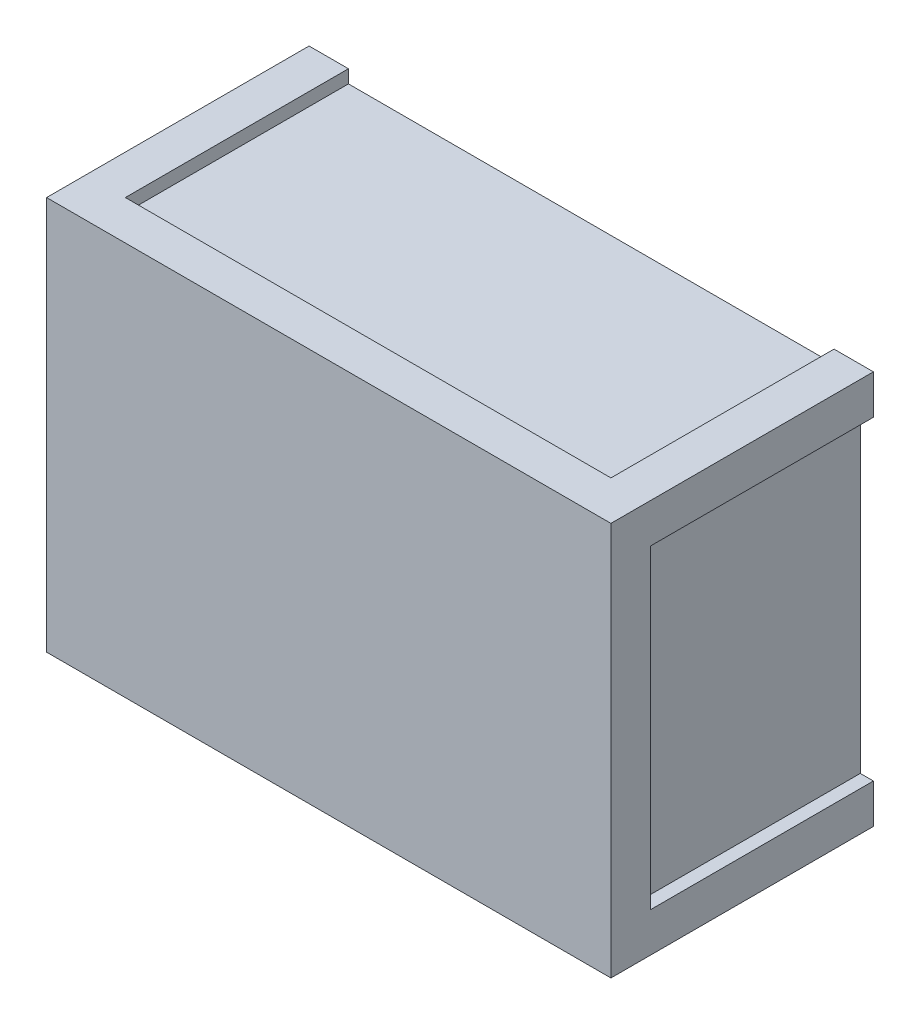
ISO-10303-21;
HEADER;
FILE_DESCRIPTION(('STEP AP214'),'2;1');
FILE_NAME('part.step','',(''),(''),'','','');
FILE_SCHEMA(('AUTOMOTIVE_DESIGN { 1 0 10303 214 1 1 1 1 }'));
ENDSEC;
DATA;
#1=APPLICATION_CONTEXT('core data for automotive mechanical design processes');
#2=APPLICATION_PROTOCOL_DEFINITION('international standard','automotive_design',2000,#1);
#3=PRODUCT_CONTEXT('',#1,'mechanical');
#4=PRODUCT('Part','Part','',(#3));
#5=PRODUCT_RELATED_PRODUCT_CATEGORY('part','',(#4));
#6=PRODUCT_DEFINITION_FORMATION('','',#4);
#7=PRODUCT_DEFINITION_CONTEXT('part definition',#1,'design');
#8=PRODUCT_DEFINITION('design','',#6,#7);
#9=PRODUCT_DEFINITION_SHAPE('','',#8);
#10=(LENGTH_UNIT() NAMED_UNIT(*) SI_UNIT(.MILLI.,.METRE.));
#11=(NAMED_UNIT(*) PLANE_ANGLE_UNIT() SI_UNIT($,.RADIAN.));
#12=(NAMED_UNIT(*) SI_UNIT($,.STERADIAN.) SOLID_ANGLE_UNIT());
#13=UNCERTAINTY_MEASURE_WITH_UNIT(LENGTH_MEASURE(1.E-05),#10,'distance_accuracy_value','');
#14=(GEOMETRIC_REPRESENTATION_CONTEXT(3) GLOBAL_UNCERTAINTY_ASSIGNED_CONTEXT((#13)) GLOBAL_UNIT_ASSIGNED_CONTEXT((#10,
#11,#12)) REPRESENTATION_CONTEXT('',''));
#15=CARTESIAN_POINT('',(0.,0.,0.));
#16=DIRECTION('',(0.,0.,1.));
#17=DIRECTION('',(1.,0.,0.));
#18=AXIS2_PLACEMENT_3D('',#15,#16,#17);
#19=CARTESIAN_POINT('',(0.,0.,0.));
#20=DIRECTION('',(0.,0.,-1.));
#21=DIRECTION('',(-1.,0.,0.));
#22=AXIS2_PLACEMENT_3D('',#19,#20,#21);
#23=PLANE('',#22);
#24=DIRECTION('',(0.,-1.,0.));
#25=VECTOR('',#24,1.);
#26=CARTESIAN_POINT('',(200.,400.,0.));
#27=LINE('',#26,#25);
#28=CARTESIAN_POINT('',(200.,2800.,0.));
#29=VERTEX_POINT('',#28);
#30=CARTESIAN_POINT('',(200.,400.,0.));
#31=VERTEX_POINT('',#30);
#32=EDGE_CURVE('E182',#29,#31,#27,.T.);
#33=ORIENTED_EDGE('',*,*,#32,.F.);
#34=DIRECTION('',(1.,0.,0.));
#35=VECTOR('',#34,1.);
#36=CARTESIAN_POINT('',(0.,2800.,0.));
#37=LINE('',#36,#35);
#38=CARTESIAN_POINT('',(99.9999999999996,2800.,0.));
#39=VERTEX_POINT('',#38);
#40=EDGE_CURVE('E189',#39,#29,#37,.T.);
#41=ORIENTED_EDGE('',*,*,#40,.F.);
#42=DIRECTION('',(0.,-1.,0.));
#43=VECTOR('',#42,1.);
#44=CARTESIAN_POINT('',(100.,100.,0.));
#45=LINE('',#44,#43);
#46=CARTESIAN_POINT('',(100.,3100.,0.));
#47=VERTEX_POINT('',#46);
#48=EDGE_CURVE('E315',#47,#39,#45,.T.);
#49=ORIENTED_EDGE('',*,*,#48,.F.);
#50=DIRECTION('',(-1.,0.,0.));
#51=VECTOR('',#50,1.);
#52=CARTESIAN_POINT('',(4400.,3100.,0.));
#53=LINE('',#52,#51);
#54=CARTESIAN_POINT('',(400.,3100.,0.));
#55=VERTEX_POINT('',#54);
#56=EDGE_CURVE('E294',#55,#47,#53,.T.);
#57=ORIENTED_EDGE('',*,*,#56,.F.);
#58=DIRECTION('',(0.,1.,0.));
#59=VECTOR('',#58,1.);
#60=CARTESIAN_POINT('',(400.,3200.,0.));
#61=LINE('',#60,#59);
#62=CARTESIAN_POINT('',(400.,3000.,0.));
#63=VERTEX_POINT('',#62);
#64=EDGE_CURVE('E251',#63,#55,#61,.T.);
#65=ORIENTED_EDGE('',*,*,#64,.F.);
#66=DIRECTION('',(-1.,0.,0.));
#67=VECTOR('',#66,1.);
#68=CARTESIAN_POINT('',(400.,3000.,0.));
#69=LINE('',#68,#67);
#70=CARTESIAN_POINT('',(4100.,3000.,0.));
#71=VERTEX_POINT('',#70);
#72=EDGE_CURVE('E244',#71,#63,#69,.T.);
#73=ORIENTED_EDGE('',*,*,#72,.F.);
#74=DIRECTION('',(0.,-1.,0.));
#75=VECTOR('',#74,1.);
#76=CARTESIAN_POINT('',(4100.,3200.,0.));
#77=LINE('',#76,#75);
#78=CARTESIAN_POINT('',(4100.,3100.,0.));
#79=VERTEX_POINT('',#78);
#80=EDGE_CURVE('E230',#79,#71,#77,.T.);
#81=ORIENTED_EDGE('',*,*,#80,.F.);
#82=CARTESIAN_POINT('',(4400.,3100.,0.));
#83=VERTEX_POINT('',#82);
#84=EDGE_CURVE('E303',#83,#79,#53,.T.);
#85=ORIENTED_EDGE('',*,*,#84,.F.);
#86=DIRECTION('',(0.,1.,0.));
#87=VECTOR('',#86,1.);
#88=CARTESIAN_POINT('',(4400.,100.,0.));
#89=LINE('',#88,#87);
#90=CARTESIAN_POINT('',(4400.,2800.,0.));
#91=VERTEX_POINT('',#90);
#92=EDGE_CURVE('E309',#91,#83,#89,.T.);
#93=ORIENTED_EDGE('',*,*,#92,.F.);
#94=DIRECTION('',(1.,0.,0.));
#95=VECTOR('',#94,1.);
#96=CARTESIAN_POINT('',(4500.,2800.,0.));
#97=LINE('',#96,#95);
#98=CARTESIAN_POINT('',(4300.,2800.,0.));
#99=VERTEX_POINT('',#98);
#100=EDGE_CURVE('E222',#99,#91,#97,.T.);
#101=ORIENTED_EDGE('',*,*,#100,.F.);
#102=DIRECTION('',(0.,1.,0.));
#103=VECTOR('',#102,1.);
#104=CARTESIAN_POINT('',(4300.,400.,0.));
#105=LINE('',#104,#103);
#106=CARTESIAN_POINT('',(4300.,400.,0.));
#107=VERTEX_POINT('',#106);
#108=EDGE_CURVE('E231',#107,#99,#105,.T.);
#109=ORIENTED_EDGE('',*,*,#108,.F.);
#110=DIRECTION('',(-1.,0.,0.));
#111=VECTOR('',#110,1.);
#112=CARTESIAN_POINT('',(4500.,400.,0.));
#113=LINE('',#112,#111);
#114=CARTESIAN_POINT('',(4400.,400.,0.));
#115=VERTEX_POINT('',#114);
#116=EDGE_CURVE('E235',#115,#107,#113,.T.);
#117=ORIENTED_EDGE('',*,*,#116,.F.);
#118=CARTESIAN_POINT('',(4400.,100.,0.));
#119=VERTEX_POINT('',#118);
#120=EDGE_CURVE('E42',#119,#115,#89,.T.);
#121=ORIENTED_EDGE('',*,*,#120,.F.);
#122=DIRECTION('',(1.,0.,0.));
#123=VECTOR('',#122,1.);
#124=CARTESIAN_POINT('',(4400.,100.,0.));
#125=LINE('',#124,#123);
#126=CARTESIAN_POINT('',(4100.,100.,0.));
#127=VERTEX_POINT('',#126);
#128=EDGE_CURVE('E314',#127,#119,#125,.T.);
#129=ORIENTED_EDGE('',*,*,#128,.F.);
#130=DIRECTION('',(0.,-1.,0.));
#131=VECTOR('',#130,1.);
#132=CARTESIAN_POINT('',(4100.,0.,0.));
#133=LINE('',#132,#131);
#134=CARTESIAN_POINT('',(4100.,200.,0.));
#135=VERTEX_POINT('',#134);
#136=EDGE_CURVE('E212',#135,#127,#133,.T.);
#137=ORIENTED_EDGE('',*,*,#136,.F.);
#138=DIRECTION('',(1.,0.,0.));
#139=VECTOR('',#138,1.);
#140=CARTESIAN_POINT('',(4100.,200.,0.));
#141=LINE('',#140,#139);
#142=CARTESIAN_POINT('',(400.,200.,0.));
#143=VERTEX_POINT('',#142);
#144=EDGE_CURVE('E203',#143,#135,#141,.T.);
#145=ORIENTED_EDGE('',*,*,#144,.F.);
#146=DIRECTION('',(0.,1.,0.));
#147=VECTOR('',#146,1.);
#148=CARTESIAN_POINT('',(400.,0.,0.));
#149=LINE('',#148,#147);
#150=CARTESIAN_POINT('',(400.,100.,0.));
#151=VERTEX_POINT('',#150);
#152=EDGE_CURVE('E210',#151,#143,#149,.T.);
#153=ORIENTED_EDGE('',*,*,#152,.F.);
#154=CARTESIAN_POINT('',(100.,100.,0.));
#155=VERTEX_POINT('',#154);
#156=EDGE_CURVE('E310',#155,#151,#125,.T.);
#157=ORIENTED_EDGE('',*,*,#156,.F.);
#158=CARTESIAN_POINT('',(99.9999999999996,400.,0.));
#159=VERTEX_POINT('',#158);
#160=EDGE_CURVE('E193',#159,#155,#45,.T.);
#161=ORIENTED_EDGE('',*,*,#160,.F.);
#162=DIRECTION('',(-1.,0.,0.));
#163=VECTOR('',#162,1.);
#164=CARTESIAN_POINT('',(0.,400.,0.));
#165=LINE('',#164,#163);
#166=EDGE_CURVE('E174',#31,#159,#165,.T.);
#167=ORIENTED_EDGE('',*,*,#166,.F.);
#168=EDGE_LOOP('',(#33,#41,#49,#57,#65,#73,#81,#85,#93,#101,#109,#117,#121,#129,#137,#145,#153,
#157,#161,#167));
#169=FACE_BOUND('',#168,.T.);
#170=ADVANCED_FACE('F35',(#169),#23,.T.);
#171=CARTESIAN_POINT('',(4400.,3100.,-5243.09069156733));
#172=DIRECTION('',(0.,1.,0.));
#173=DIRECTION('',(0.,0.,1.));
#174=AXIS2_PLACEMENT_3D('',#171,#172,#173);
#175=PLANE('',#174);
#176=DIRECTION('',(-1.,0.,0.));
#177=VECTOR('',#176,1.);
#178=CARTESIAN_POINT('',(100.,3100.,1700.));
#179=LINE('',#178,#177);
#180=CARTESIAN_POINT('',(4100.,3100.,1700.));
#181=VERTEX_POINT('',#180);
#182=CARTESIAN_POINT('',(400.,3100.,1700.));
#183=VERTEX_POINT('',#182);
#184=EDGE_CURVE('E277',#181,#183,#179,.T.);
#185=ORIENTED_EDGE('',*,*,#184,.T.);
#186=DIRECTION('',(0.,0.,-1.));
#187=VECTOR('',#186,1.);
#188=CARTESIAN_POINT('',(400.,3100.,2000.));
#189=LINE('',#188,#187);
#190=EDGE_CURVE('E49',#183,#55,#189,.T.);
#191=ORIENTED_EDGE('',*,*,#190,.T.);
#192=ORIENTED_EDGE('',*,*,#56,.T.);
#193=DIRECTION('',(0.,0.,1.));
#194=VECTOR('',#193,1.);
#195=CARTESIAN_POINT('',(100.,3100.,-5243.09069156733));
#196=LINE('',#195,#194);
#197=CARTESIAN_POINT('',(100.,3100.,2000.));
#198=VERTEX_POINT('',#197);
#199=EDGE_CURVE('E306',#47,#198,#196,.T.);
#200=ORIENTED_EDGE('',*,*,#199,.T.);
#201=DIRECTION('',(-1.,0.,0.));
#202=VECTOR('',#201,1.);
#203=CARTESIAN_POINT('',(4400.,3100.,2000.));
#204=LINE('',#203,#202);
#205=CARTESIAN_POINT('',(4400.,3100.,2000.));
#206=VERTEX_POINT('',#205);
#207=EDGE_CURVE('E298',#206,#198,#204,.T.);
#208=ORIENTED_EDGE('',*,*,#207,.F.);
#209=DIRECTION('',(0.,0.,1.));
#210=VECTOR('',#209,1.);
#211=CARTESIAN_POINT('',(4400.,3100.,-5243.09069156733));
#212=LINE('',#211,#210);
#213=EDGE_CURVE('E11',#83,#206,#212,.T.);
#214=ORIENTED_EDGE('',*,*,#213,.F.);
#215=ORIENTED_EDGE('',*,*,#84,.T.);
#216=DIRECTION('',(0.,0.,1.));
#217=VECTOR('',#216,1.);
#218=CARTESIAN_POINT('',(4100.,3100.,2000.));
#219=LINE('',#218,#217);
#220=EDGE_CURVE('E274',#79,#181,#219,.T.);
#221=ORIENTED_EDGE('',*,*,#220,.T.);
#222=EDGE_LOOP('',(#185,#191,#192,#200,#208,#214,#215,#221));
#223=FACE_BOUND('',#222,.T.);
#224=ADVANCED_FACE('F356',(#223),#175,.T.);
#225=CARTESIAN_POINT('',(100.,100.,-5243.09069156733));
#226=DIRECTION('',(-1.,0.,0.));
#227=DIRECTION('',(0.,0.,1.));
#228=AXIS2_PLACEMENT_3D('',#225,#226,#227);
#229=PLANE('',#228);
#230=ORIENTED_EDGE('',*,*,#48,.T.);
#231=DIRECTION('',(0.,0.,1.));
#232=VECTOR('',#231,1.);
#233=CARTESIAN_POINT('',(100.,2800.,2000.));
#234=LINE('',#233,#232);
#235=CARTESIAN_POINT('',(99.9999999999996,2800.,1700.));
#236=VERTEX_POINT('',#235);
#237=EDGE_CURVE('E262',#39,#236,#234,.T.);
#238=ORIENTED_EDGE('',*,*,#237,.T.);
#239=DIRECTION('',(0.,-1.,0.));
#240=VECTOR('',#239,1.);
#241=CARTESIAN_POINT('',(100.,100.,1700.));
#242=LINE('',#241,#240);
#243=CARTESIAN_POINT('',(100.,400.,1700.));
#244=VERTEX_POINT('',#243);
#245=EDGE_CURVE('E259',#236,#244,#242,.T.);
#246=ORIENTED_EDGE('',*,*,#245,.T.);
#247=DIRECTION('',(0.,0.,-1.));
#248=VECTOR('',#247,1.);
#249=CARTESIAN_POINT('',(100.,400.,2000.));
#250=LINE('',#249,#248);
#251=EDGE_CURVE('E234',#244,#159,#250,.T.);
#252=ORIENTED_EDGE('',*,*,#251,.T.);
#253=ORIENTED_EDGE('',*,*,#160,.T.);
#254=DIRECTION('',(0.,0.,1.));
#255=VECTOR('',#254,1.);
#256=CARTESIAN_POINT('',(100.,100.,-5243.09069156733));
#257=LINE('',#256,#255);
#258=CARTESIAN_POINT('',(100.,100.,2000.));
#259=VERTEX_POINT('',#258);
#260=EDGE_CURVE('E318',#155,#259,#257,.T.);
#261=ORIENTED_EDGE('',*,*,#260,.T.);
#262=DIRECTION('',(0.,-1.,0.));
#263=VECTOR('',#262,1.);
#264=CARTESIAN_POINT('',(100.,100.,2000.));
#265=LINE('',#264,#263);
#266=EDGE_CURVE('E295',#198,#259,#265,.T.);
#267=ORIENTED_EDGE('',*,*,#266,.F.);
#268=ORIENTED_EDGE('',*,*,#199,.F.);
#269=EDGE_LOOP('',(#230,#238,#246,#252,#253,#261,#267,#268));
#270=FACE_BOUND('',#269,.T.);
#271=ADVANCED_FACE('F325',(#270),#229,.T.);
#272=CARTESIAN_POINT('',(4400.,100.,-5243.09069156733));
#273=DIRECTION('',(0.,-1.,0.));
#274=DIRECTION('',(0.,0.,-1.));
#275=AXIS2_PLACEMENT_3D('',#272,#273,#274);
#276=PLANE('',#275);
#277=DIRECTION('',(1.,0.,0.));
#278=VECTOR('',#277,1.);
#279=CARTESIAN_POINT('',(100.,100.,1700.));
#280=LINE('',#279,#278);
#281=CARTESIAN_POINT('',(400.,100.,1700.));
#282=VERTEX_POINT('',#281);
#283=CARTESIAN_POINT('',(4100.,100.,1700.));
#284=VERTEX_POINT('',#283);
#285=EDGE_CURVE('E268',#282,#284,#280,.T.);
#286=ORIENTED_EDGE('',*,*,#285,.T.);
#287=DIRECTION('',(0.,0.,-1.));
#288=VECTOR('',#287,1.);
#289=CARTESIAN_POINT('',(4100.,100.,2000.));
#290=LINE('',#289,#288);
#291=EDGE_CURVE('E265',#284,#127,#290,.T.);
#292=ORIENTED_EDGE('',*,*,#291,.T.);
#293=ORIENTED_EDGE('',*,*,#128,.T.);
#294=DIRECTION('',(0.,0.,1.));
#295=VECTOR('',#294,1.);
#296=CARTESIAN_POINT('',(4400.,100.,-5243.09069156733));
#297=LINE('',#296,#295);
#298=CARTESIAN_POINT('',(4400.,100.,2000.));
#299=VERTEX_POINT('',#298);
#300=EDGE_CURVE('E313',#119,#299,#297,.T.);
#301=ORIENTED_EDGE('',*,*,#300,.T.);
#302=DIRECTION('',(1.,0.,0.));
#303=VECTOR('',#302,1.);
#304=CARTESIAN_POINT('',(4400.,100.,2000.));
#305=LINE('',#304,#303);
#306=EDGE_CURVE('E291',#259,#299,#305,.T.);
#307=ORIENTED_EDGE('',*,*,#306,.F.);
#308=ORIENTED_EDGE('',*,*,#260,.F.);
#309=ORIENTED_EDGE('',*,*,#156,.T.);
#310=DIRECTION('',(0.,0.,1.));
#311=VECTOR('',#310,1.);
#312=CARTESIAN_POINT('',(400.,100.,2000.));
#313=LINE('',#312,#311);
#314=EDGE_CURVE('E271',#151,#282,#313,.T.);
#315=ORIENTED_EDGE('',*,*,#314,.T.);
#316=EDGE_LOOP('',(#286,#292,#293,#301,#307,#308,#309,#315));
#317=FACE_BOUND('',#316,.T.);
#318=ADVANCED_FACE('F331',(#317),#276,.T.);
#319=CARTESIAN_POINT('',(4400.,100.,-5243.09069156733));
#320=DIRECTION('',(1.,0.,0.));
#321=DIRECTION('',(0.,0.,-1.));
#322=AXIS2_PLACEMENT_3D('',#319,#320,#321);
#323=PLANE('',#322);
#324=ORIENTED_EDGE('',*,*,#120,.T.);
#325=DIRECTION('',(0.,0.,1.));
#326=VECTOR('',#325,1.);
#327=CARTESIAN_POINT('',(4400.,400.,2000.));
#328=LINE('',#327,#326);
#329=CARTESIAN_POINT('',(4400.,400.,1700.));
#330=VERTEX_POINT('',#329);
#331=EDGE_CURVE('E281',#115,#330,#328,.T.);
#332=ORIENTED_EDGE('',*,*,#331,.T.);
#333=DIRECTION('',(0.,1.,0.));
#334=VECTOR('',#333,1.);
#335=CARTESIAN_POINT('',(4400.,100.,1700.));
#336=LINE('',#335,#334);
#337=CARTESIAN_POINT('',(4400.,2800.,1700.));
#338=VERTEX_POINT('',#337);
#339=EDGE_CURVE('E284',#330,#338,#336,.T.);
#340=ORIENTED_EDGE('',*,*,#339,.T.);
#341=DIRECTION('',(0.,0.,-1.));
#342=VECTOR('',#341,1.);
#343=CARTESIAN_POINT('',(4400.,2800.,2000.));
#344=LINE('',#343,#342);
#345=EDGE_CURVE('E287',#338,#91,#344,.T.);
#346=ORIENTED_EDGE('',*,*,#345,.T.);
#347=ORIENTED_EDGE('',*,*,#92,.T.);
#348=ORIENTED_EDGE('',*,*,#213,.T.);
#349=DIRECTION('',(0.,1.,0.));
#350=VECTOR('',#349,1.);
#351=CARTESIAN_POINT('',(4400.,100.,2000.));
#352=LINE('',#351,#350);
#353=EDGE_CURVE('E290',#299,#206,#352,.T.);
#354=ORIENTED_EDGE('',*,*,#353,.F.);
#355=ORIENTED_EDGE('',*,*,#300,.F.);
#356=EDGE_LOOP('',(#324,#332,#340,#346,#347,#348,#354,#355));
#357=FACE_BOUND('',#356,.T.);
#358=ADVANCED_FACE('F368',(#357),#323,.T.);
#359=CARTESIAN_POINT('',(0.,0.,2000.));
#360=DIRECTION('',(0.,0.,1.));
#361=DIRECTION('',(1.,0.,0.));
#362=AXIS2_PLACEMENT_3D('',#359,#360,#361);
#363=PLANE('',#362);
#364=ORIENTED_EDGE('',*,*,#353,.T.);
#365=ORIENTED_EDGE('',*,*,#207,.T.);
#366=ORIENTED_EDGE('',*,*,#266,.T.);
#367=ORIENTED_EDGE('',*,*,#306,.T.);
#368=EDGE_LOOP('',(#364,#365,#366,#367));
#369=FACE_BOUND('',#368,.T.);
#370=ADVANCED_FACE('F335',(#369),#363,.T.);
#371=CARTESIAN_POINT('',(0.,0.,1700.));
#372=DIRECTION('',(0.,0.,1.));
#373=DIRECTION('',(1.,0.,0.));
#374=AXIS2_PLACEMENT_3D('',#371,#372,#373);
#375=PLANE('',#374);
#376=DIRECTION('',(-1.,0.,0.));
#377=VECTOR('',#376,1.);
#378=CARTESIAN_POINT('',(4500.,400.,1700.));
#379=LINE('',#378,#377);
#380=CARTESIAN_POINT('',(4300.,400.,1700.));
#381=VERTEX_POINT('',#380);
#382=EDGE_CURVE('E228',#330,#381,#379,.T.);
#383=ORIENTED_EDGE('',*,*,#382,.T.);
#384=DIRECTION('',(0.,1.,0.));
#385=VECTOR('',#384,1.);
#386=CARTESIAN_POINT('',(4300.,400.,1700.));
#387=LINE('',#386,#385);
#388=CARTESIAN_POINT('',(4300.,2800.,1700.));
#389=VERTEX_POINT('',#388);
#390=EDGE_CURVE('E224',#381,#389,#387,.T.);
#391=ORIENTED_EDGE('',*,*,#390,.T.);
#392=DIRECTION('',(1.,0.,0.));
#393=VECTOR('',#392,1.);
#394=CARTESIAN_POINT('',(4500.,2800.,1700.));
#395=LINE('',#394,#393);
#396=EDGE_CURVE('E219',#389,#338,#395,.T.);
#397=ORIENTED_EDGE('',*,*,#396,.T.);
#398=ORIENTED_EDGE('',*,*,#339,.F.);
#399=EDGE_LOOP('',(#383,#391,#397,#398));
#400=FACE_BOUND('',#399,.T.);
#401=ADVANCED_FACE('F374',(#400),#375,.F.);
#402=CARTESIAN_POINT('',(4500.,2800.,-3705.40146272978));
#403=DIRECTION('',(0.,-1.,0.));
#404=DIRECTION('',(0.,0.,-1.));
#405=AXIS2_PLACEMENT_3D('',#402,#403,#404);
#406=PLANE('',#405);
#407=ORIENTED_EDGE('',*,*,#345,.F.);
#408=ORIENTED_EDGE('',*,*,#396,.F.);
#409=DIRECTION('',(0.,0.,1.));
#410=VECTOR('',#409,1.);
#411=CARTESIAN_POINT('',(4300.,2800.,-3705.40146272978));
#412=LINE('',#411,#410);
#413=EDGE_CURVE('E223',#99,#389,#412,.T.);
#414=ORIENTED_EDGE('',*,*,#413,.F.);
#415=ORIENTED_EDGE('',*,*,#100,.T.);
#416=EDGE_LOOP('',(#407,#408,#414,#415));
#417=FACE_BOUND('',#416,.T.);
#418=ADVANCED_FACE('F394',(#417),#406,.T.);
#419=CARTESIAN_POINT('',(4500.,400.,-3705.40146272978));
#420=DIRECTION('',(0.,1.,0.));
#421=DIRECTION('',(0.,0.,1.));
#422=AXIS2_PLACEMENT_3D('',#419,#420,#421);
#423=PLANE('',#422);
#424=ORIENTED_EDGE('',*,*,#331,.F.);
#425=ORIENTED_EDGE('',*,*,#116,.T.);
#426=DIRECTION('',(0.,0.,1.));
#427=VECTOR('',#426,1.);
#428=CARTESIAN_POINT('',(4300.,400.,-3705.40146272978));
#429=LINE('',#428,#427);
#430=EDGE_CURVE('E227',#107,#381,#429,.T.);
#431=ORIENTED_EDGE('',*,*,#430,.T.);
#432=ORIENTED_EDGE('',*,*,#382,.F.);
#433=EDGE_LOOP('',(#424,#425,#431,#432));
#434=FACE_BOUND('',#433,.T.);
#435=ADVANCED_FACE('F390',(#434),#423,.T.);
#436=CARTESIAN_POINT('',(4300.,400.,-3705.40146272978));
#437=DIRECTION('',(1.,0.,0.));
#438=DIRECTION('',(0.,0.,-1.));
#439=AXIS2_PLACEMENT_3D('',#436,#437,#438);
#440=PLANE('',#439);
#441=ORIENTED_EDGE('',*,*,#108,.T.);
#442=ORIENTED_EDGE('',*,*,#413,.T.);
#443=ORIENTED_EDGE('',*,*,#390,.F.);
#444=ORIENTED_EDGE('',*,*,#430,.F.);
#445=EDGE_LOOP('',(#441,#442,#443,#444));
#446=FACE_BOUND('',#445,.T.);
#447=ADVANCED_FACE('F393',(#446),#440,.T.);
#448=CARTESIAN_POINT('',(0.,0.,1700.));
#449=DIRECTION('',(0.,0.,1.));
#450=DIRECTION('',(1.,0.,0.));
#451=AXIS2_PLACEMENT_3D('',#448,#449,#450);
#452=PLANE('',#451);
#453=DIRECTION('',(0.,1.,0.));
#454=VECTOR('',#453,1.);
#455=CARTESIAN_POINT('',(400.,0.,1700.));
#456=LINE('',#455,#454);
#457=CARTESIAN_POINT('',(400.,200.,1700.));
#458=VERTEX_POINT('',#457);
#459=EDGE_CURVE('E205',#282,#458,#456,.T.);
#460=ORIENTED_EDGE('',*,*,#459,.T.);
#461=DIRECTION('',(1.,0.,0.));
#462=VECTOR('',#461,1.);
#463=CARTESIAN_POINT('',(4100.,200.,1700.));
#464=LINE('',#463,#462);
#465=CARTESIAN_POINT('',(4100.,200.,1700.));
#466=VERTEX_POINT('',#465);
#467=EDGE_CURVE('E200',#458,#466,#464,.T.);
#468=ORIENTED_EDGE('',*,*,#467,.T.);
#469=DIRECTION('',(0.,-1.,0.));
#470=VECTOR('',#469,1.);
#471=CARTESIAN_POINT('',(4100.,0.,1700.));
#472=LINE('',#471,#470);
#473=EDGE_CURVE('E207',#466,#284,#472,.T.);
#474=ORIENTED_EDGE('',*,*,#473,.T.);
#475=ORIENTED_EDGE('',*,*,#285,.F.);
#476=EDGE_LOOP('',(#460,#468,#474,#475));
#477=FACE_BOUND('',#476,.T.);
#478=ADVANCED_FACE('F398',(#477),#452,.F.);
#479=CARTESIAN_POINT('',(400.,0.,-3705.40146272978));
#480=DIRECTION('',(1.,0.,0.));
#481=DIRECTION('',(0.,0.,-1.));
#482=AXIS2_PLACEMENT_3D('',#479,#480,#481);
#483=PLANE('',#482);
#484=ORIENTED_EDGE('',*,*,#314,.F.);
#485=ORIENTED_EDGE('',*,*,#152,.T.);
#486=DIRECTION('',(0.,0.,1.));
#487=VECTOR('',#486,1.);
#488=CARTESIAN_POINT('',(400.,200.,-3705.40146272978));
#489=LINE('',#488,#487);
#490=EDGE_CURVE('E204',#143,#458,#489,.T.);
#491=ORIENTED_EDGE('',*,*,#490,.T.);
#492=ORIENTED_EDGE('',*,*,#459,.F.);
#493=EDGE_LOOP('',(#484,#485,#491,#492));
#494=FACE_BOUND('',#493,.T.);
#495=ADVANCED_FACE('F408',(#494),#483,.T.);
#496=CARTESIAN_POINT('',(4100.,0.,-3705.40146272978));
#497=DIRECTION('',(-1.,0.,0.));
#498=DIRECTION('',(0.,0.,1.));
#499=AXIS2_PLACEMENT_3D('',#496,#497,#498);
#500=PLANE('',#499);
#501=ORIENTED_EDGE('',*,*,#291,.F.);
#502=ORIENTED_EDGE('',*,*,#473,.F.);
#503=DIRECTION('',(0.,0.,1.));
#504=VECTOR('',#503,1.);
#505=CARTESIAN_POINT('',(4100.,200.,-3705.40146272978));
#506=LINE('',#505,#504);
#507=EDGE_CURVE('E209',#135,#466,#506,.T.);
#508=ORIENTED_EDGE('',*,*,#507,.F.);
#509=ORIENTED_EDGE('',*,*,#136,.T.);
#510=EDGE_LOOP('',(#501,#502,#508,#509));
#511=FACE_BOUND('',#510,.T.);
#512=ADVANCED_FACE('F352',(#511),#500,.T.);
#513=CARTESIAN_POINT('',(4100.,200.,-3705.40146272978));
#514=DIRECTION('',(0.,-1.,0.));
#515=DIRECTION('',(0.,0.,-1.));
#516=AXIS2_PLACEMENT_3D('',#513,#514,#515);
#517=PLANE('',#516);
#518=ORIENTED_EDGE('',*,*,#144,.T.);
#519=ORIENTED_EDGE('',*,*,#507,.T.);
#520=ORIENTED_EDGE('',*,*,#467,.F.);
#521=ORIENTED_EDGE('',*,*,#490,.F.);
#522=EDGE_LOOP('',(#518,#519,#520,#521));
#523=FACE_BOUND('',#522,.T.);
#524=ADVANCED_FACE('F346',(#523),#517,.T.);
#525=CARTESIAN_POINT('',(0.,0.,1700.));
#526=DIRECTION('',(0.,0.,-1.));
#527=DIRECTION('',(-1.,0.,0.));
#528=AXIS2_PLACEMENT_3D('',#525,#526,#527);
#529=PLANE('',#528);
#530=ORIENTED_EDGE('',*,*,#245,.F.);
#531=DIRECTION('',(1.,0.,0.));
#532=VECTOR('',#531,1.);
#533=CARTESIAN_POINT('',(0.,2800.,1700.));
#534=LINE('',#533,#532);
#535=CARTESIAN_POINT('',(200.,2800.,1700.));
#536=VERTEX_POINT('',#535);
#537=EDGE_CURVE('E198',#236,#536,#534,.T.);
#538=ORIENTED_EDGE('',*,*,#537,.T.);
#539=DIRECTION('',(0.,-1.,0.));
#540=VECTOR('',#539,1.);
#541=CARTESIAN_POINT('',(200.,400.,1700.));
#542=LINE('',#541,#540);
#543=CARTESIAN_POINT('',(200.,400.,1700.));
#544=VERTEX_POINT('',#543);
#545=EDGE_CURVE('E178',#536,#544,#542,.T.);
#546=ORIENTED_EDGE('',*,*,#545,.T.);
#547=DIRECTION('',(-1.,0.,0.));
#548=VECTOR('',#547,1.);
#549=CARTESIAN_POINT('',(0.,400.,1700.));
#550=LINE('',#549,#548);
#551=EDGE_CURVE('E57',#544,#244,#550,.T.);
#552=ORIENTED_EDGE('',*,*,#551,.T.);
#553=EDGE_LOOP('',(#530,#538,#546,#552));
#554=FACE_BOUND('',#553,.T.);
#555=ADVANCED_FACE('F344',(#554),#529,.T.);
#556=CARTESIAN_POINT('',(0.,400.,-3705.40146272978));
#557=DIRECTION('',(0.,1.,0.));
#558=DIRECTION('',(0.,0.,1.));
#559=AXIS2_PLACEMENT_3D('',#556,#557,#558);
#560=PLANE('',#559);
#561=ORIENTED_EDGE('',*,*,#251,.F.);
#562=ORIENTED_EDGE('',*,*,#551,.F.);
#563=DIRECTION('',(0.,0.,1.));
#564=VECTOR('',#563,1.);
#565=CARTESIAN_POINT('',(200.,400.,-3705.40146272978));
#566=LINE('',#565,#564);
#567=EDGE_CURVE('E170',#31,#544,#566,.T.);
#568=ORIENTED_EDGE('',*,*,#567,.F.);
#569=ORIENTED_EDGE('',*,*,#166,.T.);
#570=EDGE_LOOP('',(#561,#562,#568,#569));
#571=FACE_BOUND('',#570,.T.);
#572=ADVANCED_FACE('F172',(#571),#560,.T.);
#573=CARTESIAN_POINT('',(0.,2800.,-3705.40146272978));
#574=DIRECTION('',(0.,-1.,0.));
#575=DIRECTION('',(0.,0.,-1.));
#576=AXIS2_PLACEMENT_3D('',#573,#574,#575);
#577=PLANE('',#576);
#578=ORIENTED_EDGE('',*,*,#237,.F.);
#579=ORIENTED_EDGE('',*,*,#40,.T.);
#580=DIRECTION('',(0.,0.,1.));
#581=VECTOR('',#580,1.);
#582=CARTESIAN_POINT('',(200.,2800.,-3705.40146272978));
#583=LINE('',#582,#581);
#584=EDGE_CURVE('E185',#29,#536,#583,.T.);
#585=ORIENTED_EDGE('',*,*,#584,.T.);
#586=ORIENTED_EDGE('',*,*,#537,.F.);
#587=EDGE_LOOP('',(#578,#579,#585,#586));
#588=FACE_BOUND('',#587,.T.);
#589=ADVANCED_FACE('F340',(#588),#577,.T.);
#590=CARTESIAN_POINT('',(200.,400.,-3705.40146272978));
#591=DIRECTION('',(-1.,0.,0.));
#592=DIRECTION('',(0.,0.,1.));
#593=AXIS2_PLACEMENT_3D('',#590,#591,#592);
#594=PLANE('',#593);
#595=ORIENTED_EDGE('',*,*,#32,.T.);
#596=ORIENTED_EDGE('',*,*,#567,.T.);
#597=ORIENTED_EDGE('',*,*,#545,.F.);
#598=ORIENTED_EDGE('',*,*,#584,.F.);
#599=EDGE_LOOP('',(#595,#596,#597,#598));
#600=FACE_BOUND('',#599,.T.);
#601=ADVANCED_FACE('F183',(#600),#594,.T.);
#602=CARTESIAN_POINT('',(400.,3200.,-3705.40146272978));
#603=DIRECTION('',(1.,0.,0.));
#604=DIRECTION('',(0.,0.,-1.));
#605=AXIS2_PLACEMENT_3D('',#602,#603,#604);
#606=PLANE('',#605);
#607=ORIENTED_EDGE('',*,*,#190,.F.);
#608=DIRECTION('',(0.,1.,0.));
#609=VECTOR('',#608,1.);
#610=CARTESIAN_POINT('',(400.,3200.,1700.));
#611=LINE('',#610,#609);
#612=CARTESIAN_POINT('',(400.,3000.,1700.));
#613=VERTEX_POINT('',#612);
#614=EDGE_CURVE('E248',#613,#183,#611,.T.);
#615=ORIENTED_EDGE('',*,*,#614,.F.);
#616=DIRECTION('',(0.,0.,1.));
#617=VECTOR('',#616,1.);
#618=CARTESIAN_POINT('',(400.,3000.,-3705.40146272978));
#619=LINE('',#618,#617);
#620=EDGE_CURVE('E188',#63,#613,#619,.T.);
#621=ORIENTED_EDGE('',*,*,#620,.F.);
#622=ORIENTED_EDGE('',*,*,#64,.T.);
#623=EDGE_LOOP('',(#607,#615,#621,#622));
#624=FACE_BOUND('',#623,.T.);
#625=ADVANCED_FACE('F375',(#624),#606,.T.);
#626=CARTESIAN_POINT('',(4100.,3200.,-3705.40146272978));
#627=DIRECTION('',(-1.,0.,0.));
#628=DIRECTION('',(0.,-1.,0.));
#629=AXIS2_PLACEMENT_3D('',#626,#627,#628);
#630=PLANE('',#629);
#631=ORIENTED_EDGE('',*,*,#220,.F.);
#632=ORIENTED_EDGE('',*,*,#80,.T.);
#633=DIRECTION('',(0.,0.,1.));
#634=VECTOR('',#633,1.);
#635=CARTESIAN_POINT('',(4100.,3000.,-3705.40146272978));
#636=LINE('',#635,#634);
#637=CARTESIAN_POINT('',(4100.,3000.,1700.));
#638=VERTEX_POINT('',#637);
#639=EDGE_CURVE('E245',#71,#638,#636,.T.);
#640=ORIENTED_EDGE('',*,*,#639,.T.);
#641=DIRECTION('',(0.,-1.,0.));
#642=VECTOR('',#641,1.);
#643=CARTESIAN_POINT('',(4100.,3200.,1700.));
#644=LINE('',#643,#642);
#645=EDGE_CURVE('E246',#181,#638,#644,.T.);
#646=ORIENTED_EDGE('',*,*,#645,.F.);
#647=EDGE_LOOP('',(#631,#632,#640,#646));
#648=FACE_BOUND('',#647,.T.);
#649=ADVANCED_FACE('F378',(#648),#630,.T.);
#650=CARTESIAN_POINT('',(400.,3000.,-3705.40146272978));
#651=DIRECTION('',(0.,1.,0.));
#652=DIRECTION('',(-1.,0.,0.));
#653=AXIS2_PLACEMENT_3D('',#650,#651,#652);
#654=PLANE('',#653);
#655=ORIENTED_EDGE('',*,*,#72,.T.);
#656=ORIENTED_EDGE('',*,*,#620,.T.);
#657=DIRECTION('',(-1.,0.,0.));
#658=VECTOR('',#657,1.);
#659=CARTESIAN_POINT('',(400.,3000.,1700.));
#660=LINE('',#659,#658);
#661=EDGE_CURVE('E241',#638,#613,#660,.T.);
#662=ORIENTED_EDGE('',*,*,#661,.F.);
#663=ORIENTED_EDGE('',*,*,#639,.F.);
#664=EDGE_LOOP('',(#655,#656,#662,#663));
#665=FACE_BOUND('',#664,.T.);
#666=ADVANCED_FACE('F381',(#665),#654,.T.);
#667=CARTESIAN_POINT('',(0.,0.,1700.));
#668=DIRECTION('',(0.,0.,1.));
#669=DIRECTION('',(1.,0.,0.));
#670=AXIS2_PLACEMENT_3D('',#667,#668,#669);
#671=PLANE('',#670);
#672=ORIENTED_EDGE('',*,*,#645,.T.);
#673=ORIENTED_EDGE('',*,*,#661,.T.);
#674=ORIENTED_EDGE('',*,*,#614,.T.);
#675=ORIENTED_EDGE('',*,*,#184,.F.);
#676=EDGE_LOOP('',(#672,#673,#674,#675));
#677=FACE_BOUND('',#676,.T.);
#678=ADVANCED_FACE('F385',(#677),#671,.F.);
#679=CLOSED_SHELL('',(#170,#224,#271,#318,#358,#370,#401,#418,#435,#447,#478,#495,#512,#524,
#555,#572,#589,#601,#625,#649,#666,#678));
#680=MANIFOLD_SOLID_BREP('B2',#679);
#681=ADVANCED_BREP_SHAPE_REPRESENTATION('',(#18,#680),#14);
#682=SHAPE_DEFINITION_REPRESENTATION(#9,#681);
ENDSEC;
END-ISO-10303-21;
